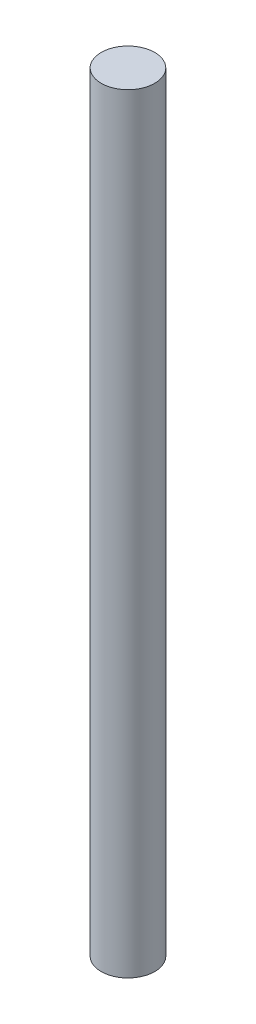
ISO-10303-21;
HEADER;
FILE_DESCRIPTION(('STEP AP214'),'2;1');
FILE_NAME('part.step','',(''),(''),'','','');
FILE_SCHEMA(('AUTOMOTIVE_DESIGN { 1 0 10303 214 1 1 1 1 }'));
ENDSEC;
DATA;
#1=APPLICATION_CONTEXT('core data for automotive mechanical design processes');
#2=APPLICATION_PROTOCOL_DEFINITION('international standard','automotive_design',2000,#1);
#3=PRODUCT_CONTEXT('',#1,'mechanical');
#4=PRODUCT('Part','Part','',(#3));
#5=PRODUCT_RELATED_PRODUCT_CATEGORY('part','',(#4));
#6=PRODUCT_DEFINITION_FORMATION('','',#4);
#7=PRODUCT_DEFINITION_CONTEXT('part definition',#1,'design');
#8=PRODUCT_DEFINITION('design','',#6,#7);
#9=PRODUCT_DEFINITION_SHAPE('','',#8);
#10=(LENGTH_UNIT() NAMED_UNIT(*) SI_UNIT(.MILLI.,.METRE.));
#11=(NAMED_UNIT(*) PLANE_ANGLE_UNIT() SI_UNIT($,.RADIAN.));
#12=(NAMED_UNIT(*) SI_UNIT($,.STERADIAN.) SOLID_ANGLE_UNIT());
#13=UNCERTAINTY_MEASURE_WITH_UNIT(LENGTH_MEASURE(1.E-05),#10,'distance_accuracy_value','');
#14=(GEOMETRIC_REPRESENTATION_CONTEXT(3) GLOBAL_UNCERTAINTY_ASSIGNED_CONTEXT((#13)) GLOBAL_UNIT_ASSIGNED_CONTEXT((#10,
#11,#12)) REPRESENTATION_CONTEXT('',''));
#15=CARTESIAN_POINT('',(0.,0.,0.));
#16=DIRECTION('',(0.,0.,1.));
#17=DIRECTION('',(1.,0.,0.));
#18=AXIS2_PLACEMENT_3D('',#15,#16,#17);
#19=CARTESIAN_POINT('',(0.,115.,0.));
#20=DIRECTION('',(0.,-1.,0.));
#21=DIRECTION('',(0.,0.,-1.));
#22=AXIS2_PLACEMENT_3D('',#19,#20,#21);
#23=CYLINDRICAL_SURFACE('',#22,4.);
#24=CARTESIAN_POINT('',(0.,115.,0.));
#25=DIRECTION('',(0.,1.,0.));
#26=DIRECTION('',(0.,0.,1.));
#27=AXIS2_PLACEMENT_3D('',#24,#25,#26);
#28=CIRCLE('',#27,4.);
#29=CARTESIAN_POINT('',(0.,115.,4.));
#30=VERTEX_POINT('',#29);
#31=EDGE_CURVE('E10',#30,#30,#28,.T.);
#32=ORIENTED_EDGE('',*,*,#31,.F.);
#33=EDGE_LOOP('',(#32));
#34=FACE_BOUND('',#33,.T.);
#35=CARTESIAN_POINT('',(0.,0.,0.));
#36=DIRECTION('',(0.,1.,0.));
#37=DIRECTION('',(0.,0.,1.));
#38=AXIS2_PLACEMENT_3D('',#35,#36,#37);
#39=CIRCLE('',#38,4.);
#40=CARTESIAN_POINT('',(0.,0.,4.));
#41=VERTEX_POINT('',#40);
#42=EDGE_CURVE('E44',#41,#41,#39,.T.);
#43=ORIENTED_EDGE('',*,*,#42,.T.);
#44=EDGE_LOOP('',(#43));
#45=FACE_BOUND('',#44,.T.);
#46=ADVANCED_FACE('F41',(#34,#45),#23,.T.);
#47=CARTESIAN_POINT('',(0.,115.,0.));
#48=DIRECTION('',(0.,1.,0.));
#49=DIRECTION('',(0.,0.,1.));
#50=AXIS2_PLACEMENT_3D('',#47,#48,#49);
#51=PLANE('',#50);
#52=ORIENTED_EDGE('',*,*,#31,.T.);
#53=EDGE_LOOP('',(#52));
#54=FACE_BOUND('',#53,.T.);
#55=ADVANCED_FACE('F58',(#54),#51,.T.);
#56=CARTESIAN_POINT('',(0.,0.,0.));
#57=DIRECTION('',(0.,1.,0.));
#58=DIRECTION('',(0.,0.,1.));
#59=AXIS2_PLACEMENT_3D('',#56,#57,#58);
#60=PLANE('',#59);
#61=ORIENTED_EDGE('',*,*,#42,.F.);
#62=EDGE_LOOP('',(#61));
#63=FACE_BOUND('',#62,.T.);
#64=ADVANCED_FACE('F56',(#63),#60,.F.);
#65=CLOSED_SHELL('',(#46,#55,#64));
#66=MANIFOLD_SOLID_BREP('B2',#65);
#67=ADVANCED_BREP_SHAPE_REPRESENTATION('',(#18,#66),#14);
#68=SHAPE_DEFINITION_REPRESENTATION(#9,#67);
ENDSEC;
END-ISO-10303-21;
